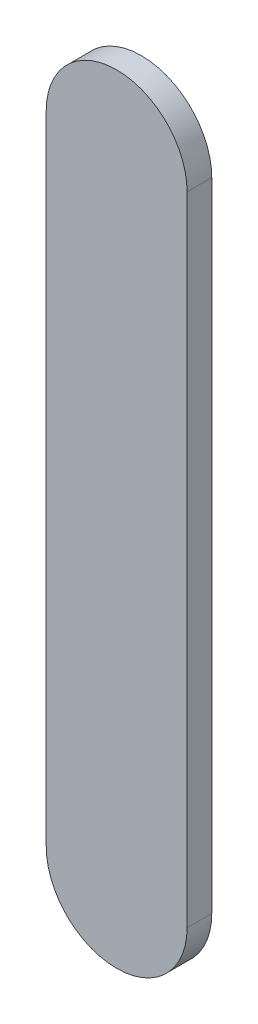
ISO-10303-21;
HEADER;
FILE_DESCRIPTION(('STEP AP214'),'2;1');
FILE_NAME('part.step','',(''),(''),'','','');
FILE_SCHEMA(('AUTOMOTIVE_DESIGN { 1 0 10303 214 1 1 1 1 }'));
ENDSEC;
DATA;
#1=APPLICATION_CONTEXT('core data for automotive mechanical design processes');
#2=APPLICATION_PROTOCOL_DEFINITION('international standard','automotive_design',2000,#1);
#3=PRODUCT_CONTEXT('',#1,'mechanical');
#4=PRODUCT('Part','Part','',(#3));
#5=PRODUCT_RELATED_PRODUCT_CATEGORY('part','',(#4));
#6=PRODUCT_DEFINITION_FORMATION('','',#4);
#7=PRODUCT_DEFINITION_CONTEXT('part definition',#1,'design');
#8=PRODUCT_DEFINITION('design','',#6,#7);
#9=PRODUCT_DEFINITION_SHAPE('','',#8);
#10=(LENGTH_UNIT() NAMED_UNIT(*) SI_UNIT(.MILLI.,.METRE.));
#11=(NAMED_UNIT(*) PLANE_ANGLE_UNIT() SI_UNIT($,.RADIAN.));
#12=(NAMED_UNIT(*) SI_UNIT($,.STERADIAN.) SOLID_ANGLE_UNIT());
#13=UNCERTAINTY_MEASURE_WITH_UNIT(LENGTH_MEASURE(1.E-05),#10,'distance_accuracy_value','');
#14=(GEOMETRIC_REPRESENTATION_CONTEXT(3) GLOBAL_UNCERTAINTY_ASSIGNED_CONTEXT((#13)) GLOBAL_UNIT_ASSIGNED_CONTEXT((#10,
#11,#12)) REPRESENTATION_CONTEXT('',''));
#15=CARTESIAN_POINT('',(0.,0.,0.));
#16=DIRECTION('',(0.,0.,1.));
#17=DIRECTION('',(1.,0.,0.));
#18=AXIS2_PLACEMENT_3D('',#15,#16,#17);
#19=CARTESIAN_POINT('',(87.95,-119.125,1.635));
#20=DIRECTION('',(0.,0.,1.));
#21=DIRECTION('',(1.,0.,0.));
#22=AXIS2_PLACEMENT_3D('',#19,#20,#21);
#23=PLANE('',#22);
#24=DIRECTION('',(0.,-1.,0.));
#25=VECTOR('',#24,1.);
#26=CARTESIAN_POINT('',(87.95,-119.125,1.635));
#27=LINE('',#26,#25);
#28=CARTESIAN_POINT('',(87.95,-119.125,1.635));
#29=VERTEX_POINT('',#28);
#30=CARTESIAN_POINT('',(87.95,-120.03,1.635));
#31=VERTEX_POINT('',#30);
#32=EDGE_CURVE('E78',#29,#31,#27,.T.);
#33=ORIENTED_EDGE('',*,*,#32,.T.);
#34=CARTESIAN_POINT('',(88.05,-120.03,1.635));
#35=DIRECTION('',(0.,0.,1.));
#36=DIRECTION('',(-1.,0.,0.));
#37=AXIS2_PLACEMENT_3D('',#34,#35,#36);
#38=CIRCLE('',#37,0.1);
#39=CARTESIAN_POINT('',(88.15,-120.03,1.635));
#40=VERTEX_POINT('',#39);
#41=EDGE_CURVE('E105',#31,#40,#38,.T.);
#42=ORIENTED_EDGE('',*,*,#41,.T.);
#43=DIRECTION('',(0.,1.,0.));
#44=VECTOR('',#43,1.);
#45=CARTESIAN_POINT('',(88.15,-120.03,1.635));
#46=LINE('',#45,#44);
#47=CARTESIAN_POINT('',(88.15,-119.125,1.635));
#48=VERTEX_POINT('',#47);
#49=EDGE_CURVE('E70',#40,#48,#46,.T.);
#50=ORIENTED_EDGE('',*,*,#49,.T.);
#51=CARTESIAN_POINT('',(88.05,-119.125,1.635));
#52=DIRECTION('',(0.,0.,1.));
#53=DIRECTION('',(1.,0.,0.));
#54=AXIS2_PLACEMENT_3D('',#51,#52,#53);
#55=CIRCLE('',#54,0.1);
#56=EDGE_CURVE('E11',#48,#29,#55,.T.);
#57=ORIENTED_EDGE('',*,*,#56,.T.);
#58=EDGE_LOOP('',(#33,#42,#50,#57));
#59=FACE_BOUND('',#58,.T.);
#60=ADVANCED_FACE('F17',(#59),#23,.T.);
#61=CARTESIAN_POINT('',(87.95,-119.125,1.6));
#62=DIRECTION('',(0.,0.,1.));
#63=DIRECTION('',(1.,0.,0.));
#64=AXIS2_PLACEMENT_3D('',#61,#62,#63);
#65=PLANE('',#64);
#66=CARTESIAN_POINT('',(88.05,-119.125,1.6));
#67=DIRECTION('',(0.,0.,1.));
#68=DIRECTION('',(1.,0.,0.));
#69=AXIS2_PLACEMENT_3D('',#66,#67,#68);
#70=CIRCLE('',#69,0.1);
#71=CARTESIAN_POINT('',(88.15,-119.125,1.6));
#72=VERTEX_POINT('',#71);
#73=CARTESIAN_POINT('',(87.95,-119.125,1.6));
#74=VERTEX_POINT('',#73);
#75=EDGE_CURVE('E26',#72,#74,#70,.T.);
#76=ORIENTED_EDGE('',*,*,#75,.F.);
#77=DIRECTION('',(0.,1.,0.));
#78=VECTOR('',#77,1.);
#79=CARTESIAN_POINT('',(88.15,-120.03,1.6));
#80=LINE('',#79,#78);
#81=CARTESIAN_POINT('',(88.15,-120.03,1.6));
#82=VERTEX_POINT('',#81);
#83=EDGE_CURVE('E101',#82,#72,#80,.T.);
#84=ORIENTED_EDGE('',*,*,#83,.F.);
#85=CARTESIAN_POINT('',(88.05,-120.03,1.6));
#86=DIRECTION('',(0.,0.,1.));
#87=DIRECTION('',(-1.,0.,0.));
#88=AXIS2_PLACEMENT_3D('',#85,#86,#87);
#89=CIRCLE('',#88,0.1);
#90=CARTESIAN_POINT('',(87.95,-120.03,1.6));
#91=VERTEX_POINT('',#90);
#92=EDGE_CURVE('E80',#91,#82,#89,.T.);
#93=ORIENTED_EDGE('',*,*,#92,.F.);
#94=DIRECTION('',(0.,-1.,0.));
#95=VECTOR('',#94,1.);
#96=CARTESIAN_POINT('',(87.95,-119.125,1.6));
#97=LINE('',#96,#95);
#98=EDGE_CURVE('E76',#74,#91,#97,.T.);
#99=ORIENTED_EDGE('',*,*,#98,.F.);
#100=EDGE_LOOP('',(#76,#84,#93,#99));
#101=FACE_BOUND('',#100,.T.);
#102=ADVANCED_FACE('F82',(#101),#65,.F.);
#103=CARTESIAN_POINT('',(88.05,-119.125,1.6));
#104=DIRECTION('',(0.,0.,-1.));
#105=DIRECTION('',(1.,0.,0.));
#106=AXIS2_PLACEMENT_3D('',#103,#104,#105);
#107=CYLINDRICAL_SURFACE('',#106,0.1);
#108=ORIENTED_EDGE('',*,*,#75,.T.);
#109=DIRECTION('',(0.,0.,1.));
#110=VECTOR('',#109,1.);
#111=CARTESIAN_POINT('',(87.95,-119.125,1.6));
#112=LINE('',#111,#110);
#113=EDGE_CURVE('E62',#74,#29,#112,.T.);
#114=ORIENTED_EDGE('',*,*,#113,.T.);
#115=ORIENTED_EDGE('',*,*,#56,.F.);
#116=DIRECTION('',(0.,0.,1.));
#117=VECTOR('',#116,1.);
#118=CARTESIAN_POINT('',(88.15,-119.125,1.6));
#119=LINE('',#118,#117);
#120=EDGE_CURVE('E65',#72,#48,#119,.T.);
#121=ORIENTED_EDGE('',*,*,#120,.F.);
#122=EDGE_LOOP('',(#108,#114,#115,#121));
#123=FACE_BOUND('',#122,.T.);
#124=ADVANCED_FACE('F61',(#123),#107,.T.);
#125=CARTESIAN_POINT('',(88.15,-120.03,1.6));
#126=DIRECTION('',(-1.,0.,0.));
#127=DIRECTION('',(0.,0.,1.));
#128=AXIS2_PLACEMENT_3D('',#125,#126,#127);
#129=PLANE('',#128);
#130=ORIENTED_EDGE('',*,*,#83,.T.);
#131=ORIENTED_EDGE('',*,*,#120,.T.);
#132=ORIENTED_EDGE('',*,*,#49,.F.);
#133=DIRECTION('',(0.,0.,1.));
#134=VECTOR('',#133,1.);
#135=CARTESIAN_POINT('',(88.15,-120.03,1.6));
#136=LINE('',#135,#134);
#137=EDGE_CURVE('E98',#82,#40,#136,.T.);
#138=ORIENTED_EDGE('',*,*,#137,.F.);
#139=EDGE_LOOP('',(#130,#131,#132,#138));
#140=FACE_BOUND('',#139,.T.);
#141=ADVANCED_FACE('F117',(#140),#129,.F.);
#142=CARTESIAN_POINT('',(88.05,-120.03,1.6));
#143=DIRECTION('',(0.,0.,-1.));
#144=DIRECTION('',(-1.,0.,0.));
#145=AXIS2_PLACEMENT_3D('',#142,#143,#144);
#146=CYLINDRICAL_SURFACE('',#145,0.1);
#147=ORIENTED_EDGE('',*,*,#92,.T.);
#148=ORIENTED_EDGE('',*,*,#137,.T.);
#149=ORIENTED_EDGE('',*,*,#41,.F.);
#150=DIRECTION('',(0.,0.,1.));
#151=VECTOR('',#150,1.);
#152=CARTESIAN_POINT('',(87.95,-120.03,1.6));
#153=LINE('',#152,#151);
#154=EDGE_CURVE('E86',#91,#31,#153,.T.);
#155=ORIENTED_EDGE('',*,*,#154,.F.);
#156=EDGE_LOOP('',(#147,#148,#149,#155));
#157=FACE_BOUND('',#156,.T.);
#158=ADVANCED_FACE('F119',(#157),#146,.T.);
#159=CARTESIAN_POINT('',(87.95,-119.125,1.6));
#160=DIRECTION('',(1.,0.,0.));
#161=DIRECTION('',(0.,1.,0.));
#162=AXIS2_PLACEMENT_3D('',#159,#160,#161);
#163=PLANE('',#162);
#164=ORIENTED_EDGE('',*,*,#98,.T.);
#165=ORIENTED_EDGE('',*,*,#154,.T.);
#166=ORIENTED_EDGE('',*,*,#32,.F.);
#167=ORIENTED_EDGE('',*,*,#113,.F.);
#168=EDGE_LOOP('',(#164,#165,#166,#167));
#169=FACE_BOUND('',#168,.T.);
#170=ADVANCED_FACE('F74',(#169),#163,.F.);
#171=CLOSED_SHELL('',(#60,#102,#124,#141,#158,#170));
#172=MANIFOLD_SOLID_BREP('B1',#171);
#173=ADVANCED_BREP_SHAPE_REPRESENTATION('',(#18,#172),#14);
#174=SHAPE_DEFINITION_REPRESENTATION(#9,#173);
ENDSEC;
END-ISO-10303-21;
